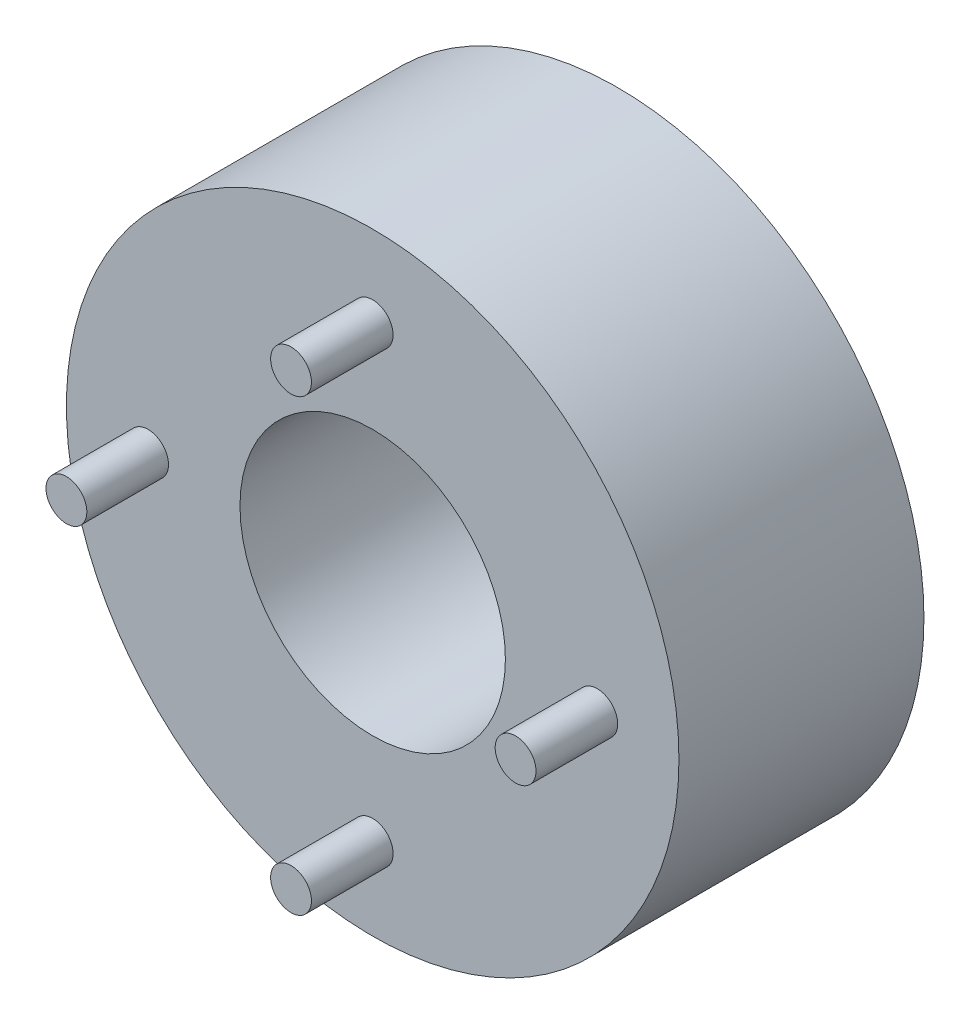
ISO-10303-21;
HEADER;
FILE_DESCRIPTION(('STEP AP214'),'2;1');
FILE_NAME('part.step','',(''),(''),'','','');
FILE_SCHEMA(('AUTOMOTIVE_DESIGN { 1 0 10303 214 1 1 1 1 }'));
ENDSEC;
DATA;
#1=APPLICATION_CONTEXT('core data for automotive mechanical design processes');
#2=APPLICATION_PROTOCOL_DEFINITION('international standard','automotive_design',2000,#1);
#3=PRODUCT_CONTEXT('',#1,'mechanical');
#4=PRODUCT('Part','Part','',(#3));
#5=PRODUCT_RELATED_PRODUCT_CATEGORY('part','',(#4));
#6=PRODUCT_DEFINITION_FORMATION('','',#4);
#7=PRODUCT_DEFINITION_CONTEXT('part definition',#1,'design');
#8=PRODUCT_DEFINITION('design','',#6,#7);
#9=PRODUCT_DEFINITION_SHAPE('','',#8);
#10=(LENGTH_UNIT() NAMED_UNIT(*) SI_UNIT(.MILLI.,.METRE.));
#11=(NAMED_UNIT(*) PLANE_ANGLE_UNIT() SI_UNIT($,.RADIAN.));
#12=(NAMED_UNIT(*) SI_UNIT($,.STERADIAN.) SOLID_ANGLE_UNIT());
#13=UNCERTAINTY_MEASURE_WITH_UNIT(LENGTH_MEASURE(1.E-05),#10,'distance_accuracy_value','');
#14=(GEOMETRIC_REPRESENTATION_CONTEXT(3) GLOBAL_UNCERTAINTY_ASSIGNED_CONTEXT((#13)) GLOBAL_UNIT_ASSIGNED_CONTEXT((#10,
#11,#12)) REPRESENTATION_CONTEXT('',''));
#15=CARTESIAN_POINT('',(0.,0.,0.));
#16=DIRECTION('',(0.,0.,1.));
#17=DIRECTION('',(1.,0.,0.));
#18=AXIS2_PLACEMENT_3D('',#15,#16,#17);
#19=CARTESIAN_POINT('',(0.,0.,0.));
#20=DIRECTION('',(0.,0.,1.));
#21=DIRECTION('',(1.,0.,0.));
#22=AXIS2_PLACEMENT_3D('',#19,#20,#21);
#23=PLANE('',#22);
#24=CARTESIAN_POINT('',(0.,0.,0.));
#25=DIRECTION('',(0.,0.,1.));
#26=DIRECTION('',(1.,0.,0.));
#27=AXIS2_PLACEMENT_3D('',#24,#25,#26);
#28=CIRCLE('',#27,7.5);
#29=CARTESIAN_POINT('',(7.5,0.,0.));
#30=VERTEX_POINT('',#29);
#31=EDGE_CURVE('E10',#30,#30,#28,.T.);
#32=ORIENTED_EDGE('',*,*,#31,.F.);
#33=EDGE_LOOP('',(#32));
#34=FACE_BOUND('',#33,.T.);
#35=CARTESIAN_POINT('',(0.,0.,0.));
#36=DIRECTION('',(0.,0.,1.));
#37=DIRECTION('',(1.,0.,0.));
#38=AXIS2_PLACEMENT_3D('',#35,#36,#37);
#39=CIRCLE('',#38,3.25);
#40=CARTESIAN_POINT('',(3.25,0.,0.));
#41=VERTEX_POINT('',#40);
#42=EDGE_CURVE('E40',#41,#41,#39,.T.);
#43=ORIENTED_EDGE('',*,*,#42,.T.);
#44=EDGE_LOOP('',(#43));
#45=FACE_BOUND('',#44,.T.);
#46=ADVANCED_FACE('F33',(#34,#45),#23,.F.);
#47=CARTESIAN_POINT('',(0.,0.,4.));
#48=DIRECTION('',(0.,0.,-1.));
#49=DIRECTION('',(-1.,0.,0.));
#50=AXIS2_PLACEMENT_3D('',#47,#48,#49);
#51=CYLINDRICAL_SURFACE('',#50,7.5);
#52=ORIENTED_EDGE('',*,*,#31,.T.);
#53=EDGE_LOOP('',(#52));
#54=FACE_BOUND('',#53,.T.);
#55=CARTESIAN_POINT('',(0.,0.,6.));
#56=DIRECTION('',(0.,0.,1.));
#57=DIRECTION('',(1.,0.,0.));
#58=AXIS2_PLACEMENT_3D('',#55,#56,#57);
#59=CIRCLE('',#58,7.5);
#60=CARTESIAN_POINT('',(7.5,0.,6.));
#61=VERTEX_POINT('',#60);
#62=EDGE_CURVE('E44',#61,#61,#59,.T.);
#63=ORIENTED_EDGE('',*,*,#62,.F.);
#64=EDGE_LOOP('',(#63));
#65=FACE_BOUND('',#64,.T.);
#66=ADVANCED_FACE('F35',(#54,#65),#51,.T.);
#67=CARTESIAN_POINT('',(0.,0.,4.));
#68=DIRECTION('',(0.,0.,-1.));
#69=DIRECTION('',(-1.,0.,0.));
#70=AXIS2_PLACEMENT_3D('',#67,#68,#69);
#71=CYLINDRICAL_SURFACE('',#70,3.25);
#72=ORIENTED_EDGE('',*,*,#42,.F.);
#73=EDGE_LOOP('',(#72));
#74=FACE_BOUND('',#73,.T.);
#75=CARTESIAN_POINT('',(0.,0.,6.));
#76=DIRECTION('',(0.,0.,1.));
#77=DIRECTION('',(1.,0.,0.));
#78=AXIS2_PLACEMENT_3D('',#75,#76,#77);
#79=CIRCLE('',#78,3.25);
#80=CARTESIAN_POINT('',(3.25,0.,6.));
#81=VERTEX_POINT('',#80);
#82=EDGE_CURVE('E48',#81,#81,#79,.T.);
#83=ORIENTED_EDGE('',*,*,#82,.T.);
#84=EDGE_LOOP('',(#83));
#85=FACE_BOUND('',#84,.T.);
#86=ADVANCED_FACE('F91',(#74,#85),#71,.F.);
#87=CARTESIAN_POINT('',(0.,0.,6.));
#88=DIRECTION('',(0.,0.,1.));
#89=DIRECTION('',(1.,0.,0.));
#90=AXIS2_PLACEMENT_3D('',#87,#88,#89);
#91=PLANE('',#90);
#92=CARTESIAN_POINT('',(-5.5,0.,6.));
#93=DIRECTION('',(0.,0.,1.));
#94=DIRECTION('',(1.,0.,0.));
#95=AXIS2_PLACEMENT_3D('',#92,#93,#94);
#96=CIRCLE('',#95,0.500000000000057);
#97=CARTESIAN_POINT('',(-4.99999999999994,0.,6.));
#98=VERTEX_POINT('',#97);
#99=EDGE_CURVE('E72',#98,#98,#96,.T.);
#100=ORIENTED_EDGE('',*,*,#99,.F.);
#101=EDGE_LOOP('',(#100));
#102=FACE_BOUND('',#101,.T.);
#103=CARTESIAN_POINT('',(0.,-5.5,6.));
#104=DIRECTION('',(0.,0.,1.));
#105=DIRECTION('',(1.,0.,0.));
#106=AXIS2_PLACEMENT_3D('',#103,#104,#105);
#107=CIRCLE('',#106,0.500000000000039);
#108=CARTESIAN_POINT('',(0.500000000000041,-5.5,6.));
#109=VERTEX_POINT('',#108);
#110=EDGE_CURVE('E66',#109,#109,#107,.T.);
#111=ORIENTED_EDGE('',*,*,#110,.F.);
#112=EDGE_LOOP('',(#111));
#113=FACE_BOUND('',#112,.T.);
#114=CARTESIAN_POINT('',(5.5,0.,6.));
#115=DIRECTION('',(0.,0.,1.));
#116=DIRECTION('',(1.,0.,0.));
#117=AXIS2_PLACEMENT_3D('',#114,#115,#116);
#118=CIRCLE('',#117,0.500000000000019);
#119=CARTESIAN_POINT('',(6.00000000000002,0.,6.));
#120=VERTEX_POINT('',#119);
#121=EDGE_CURVE('E60',#120,#120,#118,.T.);
#122=ORIENTED_EDGE('',*,*,#121,.F.);
#123=EDGE_LOOP('',(#122));
#124=FACE_BOUND('',#123,.T.);
#125=CARTESIAN_POINT('',(0.,5.5,6.));
#126=DIRECTION('',(0.,0.,1.));
#127=DIRECTION('',(1.,0.,0.));
#128=AXIS2_PLACEMENT_3D('',#125,#126,#127);
#129=CIRCLE('',#128,0.5);
#130=CARTESIAN_POINT('',(0.5,5.5,6.));
#131=VERTEX_POINT('',#130);
#132=EDGE_CURVE('E54',#131,#131,#129,.T.);
#133=ORIENTED_EDGE('',*,*,#132,.F.);
#134=EDGE_LOOP('',(#133));
#135=FACE_BOUND('',#134,.T.);
#136=ORIENTED_EDGE('',*,*,#62,.T.);
#137=EDGE_LOOP('',(#136));
#138=FACE_BOUND('',#137,.T.);
#139=ORIENTED_EDGE('',*,*,#82,.F.);
#140=EDGE_LOOP('',(#139));
#141=FACE_BOUND('',#140,.T.);
#142=ADVANCED_FACE('F87',(#102,#113,#124,#135,#138,#141),#91,.T.);
#143=CARTESIAN_POINT('',(0.,5.5,8.));
#144=DIRECTION('',(0.,0.,-1.));
#145=DIRECTION('',(-1.,0.,0.));
#146=AXIS2_PLACEMENT_3D('',#143,#144,#145);
#147=CYLINDRICAL_SURFACE('',#146,0.5);
#148=CARTESIAN_POINT('',(0.,5.5,8.));
#149=DIRECTION('',(0.,0.,1.));
#150=DIRECTION('',(1.,0.,0.));
#151=AXIS2_PLACEMENT_3D('',#148,#149,#150);
#152=CIRCLE('',#151,0.5);
#153=CARTESIAN_POINT('',(0.5,5.5,8.));
#154=VERTEX_POINT('',#153);
#155=EDGE_CURVE('E53',#154,#154,#152,.T.);
#156=ORIENTED_EDGE('',*,*,#155,.F.);
#157=EDGE_LOOP('',(#156));
#158=FACE_BOUND('',#157,.T.);
#159=ORIENTED_EDGE('',*,*,#132,.T.);
#160=EDGE_LOOP('',(#159));
#161=FACE_BOUND('',#160,.T.);
#162=ADVANCED_FACE('F90',(#158,#161),#147,.T.);
#163=CARTESIAN_POINT('',(0.,5.5,8.));
#164=DIRECTION('',(0.,0.,1.));
#165=DIRECTION('',(1.,0.,0.));
#166=AXIS2_PLACEMENT_3D('',#163,#164,#165);
#167=PLANE('',#166);
#168=ORIENTED_EDGE('',*,*,#155,.T.);
#169=EDGE_LOOP('',(#168));
#170=FACE_BOUND('',#169,.T.);
#171=ADVANCED_FACE('F138',(#170),#167,.T.);
#172=CARTESIAN_POINT('',(5.5,0.,8.));
#173=DIRECTION('',(0.,0.,-1.));
#174=DIRECTION('',(-1.,0.,0.));
#175=AXIS2_PLACEMENT_3D('',#172,#173,#174);
#176=CYLINDRICAL_SURFACE('',#175,0.500000000000019);
#177=CARTESIAN_POINT('',(5.5,0.,8.));
#178=DIRECTION('',(0.,0.,1.));
#179=DIRECTION('',(1.,0.,0.));
#180=AXIS2_PLACEMENT_3D('',#177,#178,#179);
#181=CIRCLE('',#180,0.500000000000019);
#182=CARTESIAN_POINT('',(6.00000000000002,0.,8.));
#183=VERTEX_POINT('',#182);
#184=EDGE_CURVE('E57',#183,#183,#181,.T.);
#185=ORIENTED_EDGE('',*,*,#184,.F.);
#186=EDGE_LOOP('',(#185));
#187=FACE_BOUND('',#186,.T.);
#188=ORIENTED_EDGE('',*,*,#121,.T.);
#189=EDGE_LOOP('',(#188));
#190=FACE_BOUND('',#189,.T.);
#191=ADVANCED_FACE('F148',(#187,#190),#176,.T.);
#192=CARTESIAN_POINT('',(5.5,0.,8.));
#193=DIRECTION('',(0.,0.,1.));
#194=DIRECTION('',(1.,0.,0.));
#195=AXIS2_PLACEMENT_3D('',#192,#193,#194);
#196=PLANE('',#195);
#197=ORIENTED_EDGE('',*,*,#184,.T.);
#198=EDGE_LOOP('',(#197));
#199=FACE_BOUND('',#198,.T.);
#200=ADVANCED_FACE('F158',(#199),#196,.T.);
#201=CARTESIAN_POINT('',(0.,-5.5,8.));
#202=DIRECTION('',(0.,0.,-1.));
#203=DIRECTION('',(-1.,0.,0.));
#204=AXIS2_PLACEMENT_3D('',#201,#202,#203);
#205=CYLINDRICAL_SURFACE('',#204,0.500000000000039);
#206=CARTESIAN_POINT('',(0.,-5.5,8.));
#207=DIRECTION('',(0.,0.,1.));
#208=DIRECTION('',(1.,0.,0.));
#209=AXIS2_PLACEMENT_3D('',#206,#207,#208);
#210=CIRCLE('',#209,0.500000000000039);
#211=CARTESIAN_POINT('',(0.500000000000041,-5.5,8.));
#212=VERTEX_POINT('',#211);
#213=EDGE_CURVE('E63',#212,#212,#210,.T.);
#214=ORIENTED_EDGE('',*,*,#213,.F.);
#215=EDGE_LOOP('',(#214));
#216=FACE_BOUND('',#215,.T.);
#217=ORIENTED_EDGE('',*,*,#110,.T.);
#218=EDGE_LOOP('',(#217));
#219=FACE_BOUND('',#218,.T.);
#220=ADVANCED_FACE('F168',(#216,#219),#205,.T.);
#221=CARTESIAN_POINT('',(0.,-5.5,8.));
#222=DIRECTION('',(0.,0.,1.));
#223=DIRECTION('',(1.,0.,0.));
#224=AXIS2_PLACEMENT_3D('',#221,#222,#223);
#225=PLANE('',#224);
#226=ORIENTED_EDGE('',*,*,#213,.T.);
#227=EDGE_LOOP('',(#226));
#228=FACE_BOUND('',#227,.T.);
#229=ADVANCED_FACE('F83',(#228),#225,.T.);
#230=CARTESIAN_POINT('',(-5.5,0.,8.));
#231=DIRECTION('',(0.,0.,-1.));
#232=DIRECTION('',(-1.,0.,0.));
#233=AXIS2_PLACEMENT_3D('',#230,#231,#232);
#234=CYLINDRICAL_SURFACE('',#233,0.500000000000057);
#235=CARTESIAN_POINT('',(-5.5,0.,8.));
#236=DIRECTION('',(0.,0.,1.));
#237=DIRECTION('',(1.,0.,0.));
#238=AXIS2_PLACEMENT_3D('',#235,#236,#237);
#239=CIRCLE('',#238,0.500000000000057);
#240=CARTESIAN_POINT('',(-4.99999999999994,0.,8.));
#241=VERTEX_POINT('',#240);
#242=EDGE_CURVE('E69',#241,#241,#239,.T.);
#243=ORIENTED_EDGE('',*,*,#242,.F.);
#244=EDGE_LOOP('',(#243));
#245=FACE_BOUND('',#244,.T.);
#246=ORIENTED_EDGE('',*,*,#99,.T.);
#247=EDGE_LOOP('',(#246));
#248=FACE_BOUND('',#247,.T.);
#249=ADVANCED_FACE('F80',(#245,#248),#234,.T.);
#250=CARTESIAN_POINT('',(-5.5,0.,8.));
#251=DIRECTION('',(0.,0.,1.));
#252=DIRECTION('',(1.,0.,0.));
#253=AXIS2_PLACEMENT_3D('',#250,#251,#252);
#254=PLANE('',#253);
#255=ORIENTED_EDGE('',*,*,#242,.T.);
#256=EDGE_LOOP('',(#255));
#257=FACE_BOUND('',#256,.T.);
#258=ADVANCED_FACE('F78',(#257),#254,.T.);
#259=CLOSED_SHELL('',(#46,#66,#86,#142,#162,#171,#191,#200,#220,#229,#249,#258));
#260=MANIFOLD_SOLID_BREP('B2',#259);
#261=ADVANCED_BREP_SHAPE_REPRESENTATION('',(#18,#260),#14);
#262=SHAPE_DEFINITION_REPRESENTATION(#9,#261);
ENDSEC;
END-ISO-10303-21;
